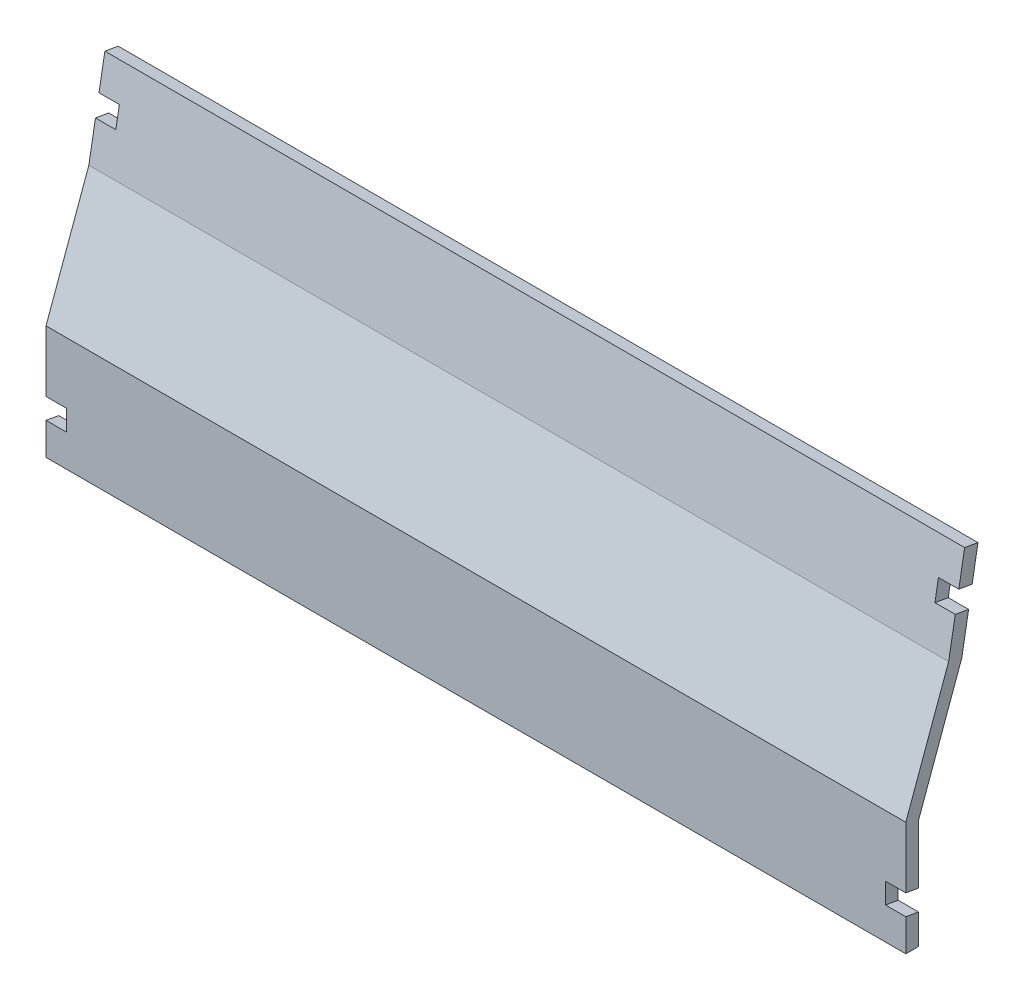
ISO-10303-21;
HEADER;
FILE_DESCRIPTION(('STEP AP214'),'2;1');
FILE_NAME('part.step','',(''),(''),'','','');
FILE_SCHEMA(('AUTOMOTIVE_DESIGN { 1 0 10303 214 1 1 1 1 }'));
ENDSEC;
DATA;
#1=APPLICATION_CONTEXT('core data for automotive mechanical design processes');
#2=APPLICATION_PROTOCOL_DEFINITION('international standard','automotive_design',2000,#1);
#3=PRODUCT_CONTEXT('',#1,'mechanical');
#4=PRODUCT('Part','Part','',(#3));
#5=PRODUCT_RELATED_PRODUCT_CATEGORY('part','',(#4));
#6=PRODUCT_DEFINITION_FORMATION('','',#4);
#7=PRODUCT_DEFINITION_CONTEXT('part definition',#1,'design');
#8=PRODUCT_DEFINITION('design','',#6,#7);
#9=PRODUCT_DEFINITION_SHAPE('','',#8);
#10=(LENGTH_UNIT() NAMED_UNIT(*) SI_UNIT(.MILLI.,.METRE.));
#11=(NAMED_UNIT(*) PLANE_ANGLE_UNIT() SI_UNIT($,.RADIAN.));
#12=(NAMED_UNIT(*) SI_UNIT($,.STERADIAN.) SOLID_ANGLE_UNIT());
#13=UNCERTAINTY_MEASURE_WITH_UNIT(LENGTH_MEASURE(1.E-05),#10,'distance_accuracy_value','');
#14=(GEOMETRIC_REPRESENTATION_CONTEXT(3) GLOBAL_UNCERTAINTY_ASSIGNED_CONTEXT((#13)) GLOBAL_UNIT_ASSIGNED_CONTEXT((#10,
#11,#12)) REPRESENTATION_CONTEXT('',''));
#15=CARTESIAN_POINT('',(0.,0.,0.));
#16=DIRECTION('',(0.,0.,1.));
#17=DIRECTION('',(1.,0.,0.));
#18=AXIS2_PLACEMENT_3D('',#15,#16,#17);
#19=CARTESIAN_POINT('',(322.072,0.,0.));
#20=DIRECTION('',(1.,0.,0.));
#21=DIRECTION('',(0.,0.,-1.));
#22=AXIS2_PLACEMENT_3D('',#19,#20,#21);
#23=PLANE('',#22);
#24=DIRECTION('',(0.,-0.173648177666933,-0.984807753012208));
#25=VECTOR('',#24,1.);
#26=CARTESIAN_POINT('',(322.072,21.8851789146028,-3.85894752027653));
#27=LINE('',#26,#25);
#28=CARTESIAN_POINT('',(322.072,-16.1026707954497,-219.298748947264));
#29=VERTEX_POINT('',#28);
#30=CARTESIAN_POINT('',(322.072,-16.9848035379977,-224.301572332566));
#31=VERTEX_POINT('',#30);
#32=EDGE_CURVE('E334',#29,#31,#27,.T.);
#33=ORIENTED_EDGE('',*,*,#32,.F.);
#34=DIRECTION('',(0.,-0.984807753012207,0.173648177666934));
#35=VECTOR('',#34,1.);
#36=CARTESIAN_POINT('',(322.072,3.8157747259693,-222.810908306462));
#37=LINE('',#36,#35);
#38=CARTESIAN_POINT('',(322.072,-30.1912873343013,-216.814545730609));
#39=VERTEX_POINT('',#38);
#40=EDGE_CURVE('E443',#29,#39,#37,.T.);
#41=ORIENTED_EDGE('',*,*,#40,.T.);
#42=DIRECTION('',(0.,-0.939692620785907,0.342020143325672));
#43=VECTOR('',#42,1.);
#44=CARTESIAN_POINT('',(322.072,-30.1912873343013,-216.814545730609));
#45=LINE('',#44,#43);
#46=CARTESIAN_POINT('',(322.072,-74.2791887182114,-200.767861935602));
#47=VERTEX_POINT('',#46);
#48=EDGE_CURVE('E448',#39,#47,#45,.T.);
#49=ORIENTED_EDGE('',*,*,#48,.T.);
#50=DIRECTION('',(0.,-1.,0.));
#51=VECTOR('',#50,1.);
#52=CARTESIAN_POINT('',(322.072,-116.964716492043,-200.767861935602));
#53=LINE('',#52,#51);
#54=CARTESIAN_POINT('',(322.072,-97.1913183543955,-200.767861935602));
#55=VERTEX_POINT('',#54);
#56=EDGE_CURVE('E451',#47,#55,#53,.T.);
#57=ORIENTED_EDGE('',*,*,#56,.T.);
#58=DIRECTION('',(0.,0.173648177666932,0.984807753012208));
#59=VECTOR('',#58,1.);
#60=CARTESIAN_POINT('',(322.072,-59.9273150510358,10.5668025249142));
#61=LINE('',#60,#59);
#62=CARTESIAN_POINT('',(322.072,-98.033039620491,-205.541500449194));
#63=VERTEX_POINT('',#62);
#64=EDGE_CURVE('E214',#63,#55,#61,.T.);
#65=ORIENTED_EDGE('',*,*,#64,.F.);
#66=DIRECTION('',(0.,1.,0.));
#67=VECTOR('',#66,1.);
#68=CARTESIAN_POINT('',(322.072,-76.0166510463058,-205.541500449194));
#69=LINE('',#68,#67);
#70=CARTESIAN_POINT('',(322.072,-76.0166510463058,-205.541500449194));
#71=VERTEX_POINT('',#70);
#72=EDGE_CURVE('E234',#63,#71,#69,.T.);
#73=ORIENTED_EDGE('',*,*,#72,.T.);
#74=DIRECTION('',(0.,0.939692620785907,-0.342020143325672));
#75=VECTOR('',#74,1.);
#76=CARTESIAN_POINT('',(322.072,-76.0166510463058,-205.541500449194));
#77=LINE('',#76,#75);
#78=CARTESIAN_POINT('',(322.072,-31.5111104086854,-221.740192501213));
#79=VERTEX_POINT('',#78);
#80=EDGE_CURVE('E233',#71,#79,#77,.T.);
#81=ORIENTED_EDGE('',*,*,#80,.T.);
#82=DIRECTION('',(0.,0.984807753012207,-0.173648177666934));
#83=VECTOR('',#82,1.);
#84=CARTESIAN_POINT('',(322.072,2.93364198342128,-227.813731691764));
#85=LINE('',#84,#83);
#86=EDGE_CURVE('E436',#79,#31,#85,.T.);
#87=ORIENTED_EDGE('',*,*,#86,.T.);
#88=EDGE_LOOP('',(#33,#41,#49,#57,#65,#73,#81,#87));
#89=FACE_BOUND('',#88,.T.);
#90=ADVANCED_FACE('F45',(#89),#23,.T.);
#91=DIRECTION('',(0.,0.173648177666933,0.984807753012208));
#92=VECTOR('',#91,1.);
#93=CARTESIAN_POINT('',(322.072,29.389413992556,-5.1821466340986));
#94=LINE('',#93,#92);
#95=CARTESIAN_POINT('',(322.072,-9.48056846004469,-225.624771446388));
#96=VERTEX_POINT('',#95);
#97=CARTESIAN_POINT('',(322.072,-8.59843571749667,-220.621948061086));
#98=VERTEX_POINT('',#97);
#99=EDGE_CURVE('E331',#96,#98,#94,.T.);
#100=ORIENTED_EDGE('',*,*,#99,.F.);
#101=CARTESIAN_POINT('',(322.072,2.93364198342128,-227.813731691764));
#102=VERTEX_POINT('',#101);
#103=EDGE_CURVE('E275',#96,#102,#85,.T.);
#104=ORIENTED_EDGE('',*,*,#103,.T.);
#105=DIRECTION('',(0.,0.173648177666933,0.984807753012207));
#106=VECTOR('',#105,1.);
#107=CARTESIAN_POINT('',(322.072,3.8157747259693,-222.810908306462));
#108=LINE('',#107,#106);
#109=CARTESIAN_POINT('',(322.072,3.8157747259693,-222.810908306462));
#110=VERTEX_POINT('',#109);
#111=EDGE_CURVE('E440',#102,#110,#108,.T.);
#112=ORIENTED_EDGE('',*,*,#111,.T.);
#113=EDGE_CURVE('E444',#110,#98,#37,.T.);
#114=ORIENTED_EDGE('',*,*,#113,.T.);
#115=EDGE_LOOP('',(#100,#104,#112,#114));
#116=FACE_BOUND('',#115,.T.);
#117=ADVANCED_FACE('F502',(#116),#23,.T.);
#118=CARTESIAN_POINT('',(0.,0.,0.));
#119=DIRECTION('',(1.,0.,0.));
#120=DIRECTION('',(0.,0.,-1.));
#121=AXIS2_PLACEMENT_3D('',#118,#119,#120);
#122=PLANE('',#121);
#123=DIRECTION('',(0.,0.984807753012207,-0.173648177666934));
#124=VECTOR('',#123,1.);
#125=CARTESIAN_POINT('',(0.,2.93364198342128,-227.813731691764));
#126=LINE('',#125,#124);
#127=CARTESIAN_POINT('',(0.,-9.4805684600447,-225.624771446388));
#128=VERTEX_POINT('',#127);
#129=CARTESIAN_POINT('',(0.,2.93364198342128,-227.813731691764));
#130=VERTEX_POINT('',#129);
#131=EDGE_CURVE('E248',#128,#130,#126,.T.);
#132=ORIENTED_EDGE('',*,*,#131,.F.);
#133=DIRECTION('',(0.,0.173648177666933,0.984807753012208));
#134=VECTOR('',#133,1.);
#135=CARTESIAN_POINT('',(0.,29.389413992556,-5.1821466340986));
#136=LINE('',#135,#134);
#137=CARTESIAN_POINT('',(0.,-8.59843571749667,-220.621948061086));
#138=VERTEX_POINT('',#137);
#139=EDGE_CURVE('E318',#128,#138,#136,.T.);
#140=ORIENTED_EDGE('',*,*,#139,.T.);
#141=DIRECTION('',(0.,-0.984807753012207,0.173648177666934));
#142=VECTOR('',#141,1.);
#143=CARTESIAN_POINT('',(0.,3.8157747259693,-222.810908306462));
#144=LINE('',#143,#142);
#145=CARTESIAN_POINT('',(0.,3.8157747259693,-222.810908306462));
#146=VERTEX_POINT('',#145);
#147=EDGE_CURVE('E252',#146,#138,#144,.T.);
#148=ORIENTED_EDGE('',*,*,#147,.F.);
#149=DIRECTION('',(0.,0.173648177666933,0.984807753012207));
#150=VECTOR('',#149,1.);
#151=CARTESIAN_POINT('',(0.,3.8157747259693,-222.810908306462));
#152=LINE('',#151,#150);
#153=EDGE_CURVE('E247',#130,#146,#152,.T.);
#154=ORIENTED_EDGE('',*,*,#153,.F.);
#155=EDGE_LOOP('',(#132,#140,#148,#154));
#156=FACE_BOUND('',#155,.T.);
#157=ADVANCED_FACE('F495',(#156),#122,.F.);
#158=CARTESIAN_POINT('',(0.,-16.1026707954497,-219.298748947264));
#159=VERTEX_POINT('',#158);
#160=CARTESIAN_POINT('',(0.,-30.1912873343013,-216.814545730609));
#161=VERTEX_POINT('',#160);
#162=EDGE_CURVE('E251',#159,#161,#144,.T.);
#163=ORIENTED_EDGE('',*,*,#162,.F.);
#164=DIRECTION('',(0.,-0.173648177666933,-0.984807753012208));
#165=VECTOR('',#164,1.);
#166=CARTESIAN_POINT('',(0.,21.8851789146028,-3.85894752027653));
#167=LINE('',#166,#165);
#168=CARTESIAN_POINT('',(0.,-16.9848035379977,-224.301572332566));
#169=VERTEX_POINT('',#168);
#170=EDGE_CURVE('E314',#159,#169,#167,.T.);
#171=ORIENTED_EDGE('',*,*,#170,.T.);
#172=CARTESIAN_POINT('',(0.,-31.5111104086854,-221.740192501213));
#173=VERTEX_POINT('',#172);
#174=EDGE_CURVE('E243',#173,#169,#126,.T.);
#175=ORIENTED_EDGE('',*,*,#174,.F.);
#176=DIRECTION('',(0.,0.939692620785907,-0.342020143325672));
#177=VECTOR('',#176,1.);
#178=CARTESIAN_POINT('',(0.,-76.0166510463058,-205.541500449194));
#179=LINE('',#178,#177);
#180=CARTESIAN_POINT('',(0.,-76.0166510463058,-205.541500449194));
#181=VERTEX_POINT('',#180);
#182=EDGE_CURVE('E272',#181,#173,#179,.T.);
#183=ORIENTED_EDGE('',*,*,#182,.F.);
#184=DIRECTION('',(0.,1.,0.));
#185=VECTOR('',#184,1.);
#186=CARTESIAN_POINT('',(0.,-76.0166510463058,-205.541500449194));
#187=LINE('',#186,#185);
#188=CARTESIAN_POINT('',(0.,-98.033039620491,-205.541500449194));
#189=VERTEX_POINT('',#188);
#190=EDGE_CURVE('E267',#189,#181,#187,.T.);
#191=ORIENTED_EDGE('',*,*,#190,.F.);
#192=DIRECTION('',(0.,0.173648177666932,0.984807753012208));
#193=VECTOR('',#192,1.);
#194=CARTESIAN_POINT('',(0.,-59.9273150510358,10.5668025249142));
#195=LINE('',#194,#193);
#196=CARTESIAN_POINT('',(0.,-97.1913183543955,-200.767861935602));
#197=VERTEX_POINT('',#196);
#198=EDGE_CURVE('E310',#189,#197,#195,.T.);
#199=ORIENTED_EDGE('',*,*,#198,.T.);
#200=DIRECTION('',(0.,-1.,0.));
#201=VECTOR('',#200,1.);
#202=CARTESIAN_POINT('',(0.,-116.964716492043,-200.767861935602));
#203=LINE('',#202,#201);
#204=CARTESIAN_POINT('',(0.,-74.2791887182114,-200.767861935602));
#205=VERTEX_POINT('',#204);
#206=EDGE_CURVE('E260',#205,#197,#203,.T.);
#207=ORIENTED_EDGE('',*,*,#206,.F.);
#208=DIRECTION('',(0.,-0.939692620785907,0.342020143325672));
#209=VECTOR('',#208,1.);
#210=CARTESIAN_POINT('',(0.,-30.1912873343013,-216.814545730609));
#211=LINE('',#210,#209);
#212=EDGE_CURVE('E256',#161,#205,#211,.T.);
#213=ORIENTED_EDGE('',*,*,#212,.F.);
#214=EDGE_LOOP('',(#163,#171,#175,#183,#191,#199,#207,#213));
#215=FACE_BOUND('',#214,.T.);
#216=ADVANCED_FACE('F480',(#215),#122,.F.);
#217=CARTESIAN_POINT('',(322.072,2.93364198342128,-227.813731691764));
#218=DIRECTION('',(0.,0.173648177666934,0.984807753012207));
#219=DIRECTION('',(0.,-0.984807753012208,0.173648177666934));
#220=AXIS2_PLACEMENT_3D('',#217,#218,#219);
#221=PLANE('',#220);
#222=DIRECTION('',(0.,0.984807753012208,-0.173648177666934));
#223=VECTOR('',#222,1.);
#224=CARTESIAN_POINT('',(314.452,2.93364198342128,-227.813731691764));
#225=LINE('',#224,#223);
#226=CARTESIAN_POINT('',(314.452,-16.9848035379977,-224.301572332566));
#227=VERTEX_POINT('',#226);
#228=CARTESIAN_POINT('',(314.452,-9.4805684600447,-225.624771446388));
#229=VERTEX_POINT('',#228);
#230=EDGE_CURVE('E377',#227,#229,#225,.T.);
#231=ORIENTED_EDGE('',*,*,#230,.F.);
#232=DIRECTION('',(1.,0.,0.));
#233=VECTOR('',#232,1.);
#234=CARTESIAN_POINT('',(322.072,-16.9848035379977,-224.301572332566));
#235=LINE('',#234,#233);
#236=EDGE_CURVE('E370',#227,#31,#235,.T.);
#237=ORIENTED_EDGE('',*,*,#236,.T.);
#238=ORIENTED_EDGE('',*,*,#86,.F.);
#239=DIRECTION('',(-1.,0.,0.));
#240=VECTOR('',#239,1.);
#241=CARTESIAN_POINT('',(322.072,-31.5111104086854,-221.740192501213));
#242=LINE('',#241,#240);
#243=EDGE_CURVE('E238',#79,#173,#242,.T.);
#244=ORIENTED_EDGE('',*,*,#243,.T.);
#245=ORIENTED_EDGE('',*,*,#174,.T.);
#246=DIRECTION('',(1.,0.,0.));
#247=VECTOR('',#246,1.);
#248=CARTESIAN_POINT('',(322.072,-16.9848035379977,-224.301572332566));
#249=LINE('',#248,#247);
#250=CARTESIAN_POINT('',(7.62000000000001,-16.9848035379977,-224.301572332566));
#251=VERTEX_POINT('',#250);
#252=EDGE_CURVE('E416',#169,#251,#249,.T.);
#253=ORIENTED_EDGE('',*,*,#252,.T.);
#254=DIRECTION('',(0.,0.984807753012208,-0.173648177666934));
#255=VECTOR('',#254,1.);
#256=CARTESIAN_POINT('',(7.62000000000002,2.93364198342128,-227.813731691764));
#257=LINE('',#256,#255);
#258=CARTESIAN_POINT('',(7.62000000000001,-9.4805684600447,-225.624771446388));
#259=VERTEX_POINT('',#258);
#260=EDGE_CURVE('E432',#251,#259,#257,.T.);
#261=ORIENTED_EDGE('',*,*,#260,.T.);
#262=DIRECTION('',(-1.,0.,0.));
#263=VECTOR('',#262,1.);
#264=CARTESIAN_POINT('',(322.072,-9.4805684600447,-225.624771446388));
#265=LINE('',#264,#263);
#266=EDGE_CURVE('E424',#259,#128,#265,.T.);
#267=ORIENTED_EDGE('',*,*,#266,.T.);
#268=ORIENTED_EDGE('',*,*,#131,.T.);
#269=DIRECTION('',(-1.,0.,0.));
#270=VECTOR('',#269,1.);
#271=CARTESIAN_POINT('',(322.072,2.93364198342128,-227.813731691764));
#272=LINE('',#271,#270);
#273=EDGE_CURVE('E302',#102,#130,#272,.T.);
#274=ORIENTED_EDGE('',*,*,#273,.F.);
#275=ORIENTED_EDGE('',*,*,#103,.F.);
#276=DIRECTION('',(-1.,0.,0.));
#277=VECTOR('',#276,1.);
#278=CARTESIAN_POINT('',(322.072,-9.4805684600447,-225.624771446388));
#279=LINE('',#278,#277);
#280=EDGE_CURVE('E69',#96,#229,#279,.T.);
#281=ORIENTED_EDGE('',*,*,#280,.T.);
#282=EDGE_LOOP('',(#231,#237,#238,#244,#245,#253,#261,#267,#268,#274,#275,#281));
#283=FACE_BOUND('',#282,.T.);
#284=ADVANCED_FACE('F47',(#283),#221,.F.);
#285=CARTESIAN_POINT('',(322.072,3.8157747259693,-222.810908306462));
#286=DIRECTION('',(0.,-0.984807753012207,0.173648177666933));
#287=DIRECTION('',(0.,-0.173648177666933,-0.984807753012208));
#288=AXIS2_PLACEMENT_3D('',#285,#286,#287);
#289=PLANE('',#288);
#290=ORIENTED_EDGE('',*,*,#153,.T.);
#291=DIRECTION('',(-1.,0.,0.));
#292=VECTOR('',#291,1.);
#293=CARTESIAN_POINT('',(322.072,3.8157747259693,-222.810908306462));
#294=LINE('',#293,#292);
#295=EDGE_CURVE('E298',#110,#146,#294,.T.);
#296=ORIENTED_EDGE('',*,*,#295,.F.);
#297=ORIENTED_EDGE('',*,*,#111,.F.);
#298=ORIENTED_EDGE('',*,*,#273,.T.);
#299=EDGE_LOOP('',(#290,#296,#297,#298));
#300=FACE_BOUND('',#299,.T.);
#301=ADVANCED_FACE('F499',(#300),#289,.F.);
#302=CARTESIAN_POINT('',(322.072,3.8157747259693,-222.810908306462));
#303=DIRECTION('',(0.,-0.173648177666934,-0.984807753012207));
#304=DIRECTION('',(0.,0.984807753012208,-0.173648177666934));
#305=AXIS2_PLACEMENT_3D('',#302,#303,#304);
#306=PLANE('',#305);
#307=ORIENTED_EDGE('',*,*,#40,.F.);
#308=DIRECTION('',(-1.,0.,0.));
#309=VECTOR('',#308,1.);
#310=CARTESIAN_POINT('',(322.072,-16.1026707954497,-219.298748947264));
#311=LINE('',#310,#309);
#312=CARTESIAN_POINT('',(314.452,-16.1026707954497,-219.298748947264));
#313=VERTEX_POINT('',#312);
#314=EDGE_CURVE('E366',#29,#313,#311,.T.);
#315=ORIENTED_EDGE('',*,*,#314,.T.);
#316=DIRECTION('',(0.,-0.984807753012208,0.173648177666934));
#317=VECTOR('',#316,1.);
#318=CARTESIAN_POINT('',(314.452,3.8157747259693,-222.810908306462));
#319=LINE('',#318,#317);
#320=CARTESIAN_POINT('',(314.452,-8.59843571749667,-220.621948061086));
#321=VERTEX_POINT('',#320);
#322=EDGE_CURVE('E11',#321,#313,#319,.T.);
#323=ORIENTED_EDGE('',*,*,#322,.F.);
#324=DIRECTION('',(1.,0.,0.));
#325=VECTOR('',#324,1.);
#326=CARTESIAN_POINT('',(322.072,-8.59843571749667,-220.621948061086));
#327=LINE('',#326,#325);
#328=EDGE_CURVE('E357',#321,#98,#327,.T.);
#329=ORIENTED_EDGE('',*,*,#328,.T.);
#330=ORIENTED_EDGE('',*,*,#113,.F.);
#331=ORIENTED_EDGE('',*,*,#295,.T.);
#332=ORIENTED_EDGE('',*,*,#147,.T.);
#333=DIRECTION('',(1.,0.,0.));
#334=VECTOR('',#333,1.);
#335=CARTESIAN_POINT('',(322.072,-8.59843571749667,-220.621948061086));
#336=LINE('',#335,#334);
#337=CARTESIAN_POINT('',(7.62000000000001,-8.59843571749667,-220.621948061086));
#338=VERTEX_POINT('',#337);
#339=EDGE_CURVE('E420',#138,#338,#336,.T.);
#340=ORIENTED_EDGE('',*,*,#339,.T.);
#341=DIRECTION('',(0.,-0.984807753012208,0.173648177666934));
#342=VECTOR('',#341,1.);
#343=CARTESIAN_POINT('',(7.62000000000002,3.8157747259693,-222.810908306462));
#344=LINE('',#343,#342);
#345=CARTESIAN_POINT('',(7.62000000000001,-16.1026707954497,-219.298748947264));
#346=VERTEX_POINT('',#345);
#347=EDGE_CURVE('E215',#338,#346,#344,.T.);
#348=ORIENTED_EDGE('',*,*,#347,.T.);
#349=DIRECTION('',(-1.,0.,0.));
#350=VECTOR('',#349,1.);
#351=CARTESIAN_POINT('',(322.072,-16.1026707954497,-219.298748947264));
#352=LINE('',#351,#350);
#353=EDGE_CURVE('E412',#346,#159,#352,.T.);
#354=ORIENTED_EDGE('',*,*,#353,.T.);
#355=ORIENTED_EDGE('',*,*,#162,.T.);
#356=DIRECTION('',(-1.,0.,0.));
#357=VECTOR('',#356,1.);
#358=CARTESIAN_POINT('',(322.072,-30.1912873343013,-216.814545730609));
#359=LINE('',#358,#357);
#360=EDGE_CURVE('E294',#39,#161,#359,.T.);
#361=ORIENTED_EDGE('',*,*,#360,.F.);
#362=EDGE_LOOP('',(#307,#315,#323,#329,#330,#331,#332,#340,#348,#354,#355,#361));
#363=FACE_BOUND('',#362,.T.);
#364=ADVANCED_FACE('F511',(#363),#306,.F.);
#365=CARTESIAN_POINT('',(322.072,-30.1912873343013,-216.814545730609));
#366=DIRECTION('',(0.,-0.342020143325672,-0.939692620785907));
#367=DIRECTION('',(0.,0.939692620785907,-0.342020143325672));
#368=AXIS2_PLACEMENT_3D('',#365,#366,#367);
#369=PLANE('',#368);
#370=ORIENTED_EDGE('',*,*,#212,.T.);
#371=DIRECTION('',(-1.,0.,0.));
#372=VECTOR('',#371,1.);
#373=CARTESIAN_POINT('',(322.072,-74.2791887182114,-200.767861935602));
#374=LINE('',#373,#372);
#375=EDGE_CURVE('E290',#47,#205,#374,.T.);
#376=ORIENTED_EDGE('',*,*,#375,.F.);
#377=ORIENTED_EDGE('',*,*,#48,.F.);
#378=ORIENTED_EDGE('',*,*,#360,.T.);
#379=EDGE_LOOP('',(#370,#376,#377,#378));
#380=FACE_BOUND('',#379,.T.);
#381=ADVANCED_FACE('F514',(#380),#369,.F.);
#382=CARTESIAN_POINT('',(322.072,-116.964716492043,-200.767861935602));
#383=DIRECTION('',(0.,0.,-1.));
#384=DIRECTION('',(-1.,0.,0.));
#385=AXIS2_PLACEMENT_3D('',#382,#383,#384);
#386=PLANE('',#385);
#387=DIRECTION('',(0.,-1.,0.));
#388=VECTOR('',#387,1.);
#389=CARTESIAN_POINT('',(314.452,-116.964716492043,-200.767861935602));
#390=LINE('',#389,#388);
#391=CARTESIAN_POINT('',(314.452,-97.1913183543955,-200.767861935602));
#392=VERTEX_POINT('',#391);
#393=CARTESIAN_POINT('',(314.452,-104.928869136965,-200.767861935602));
#394=VERTEX_POINT('',#393);
#395=EDGE_CURVE('E374',#392,#394,#390,.T.);
#396=ORIENTED_EDGE('',*,*,#395,.F.);
#397=DIRECTION('',(1.,0.,0.));
#398=VECTOR('',#397,1.);
#399=CARTESIAN_POINT('',(322.072,-97.1913183543955,-200.767861935602));
#400=LINE('',#399,#398);
#401=EDGE_CURVE('E349',#392,#55,#400,.T.);
#402=ORIENTED_EDGE('',*,*,#401,.T.);
#403=ORIENTED_EDGE('',*,*,#56,.F.);
#404=ORIENTED_EDGE('',*,*,#375,.T.);
#405=ORIENTED_EDGE('',*,*,#206,.T.);
#406=DIRECTION('',(1.,0.,0.));
#407=VECTOR('',#406,1.);
#408=CARTESIAN_POINT('',(322.072,-97.1913183543955,-200.767861935602));
#409=LINE('',#408,#407);
#410=CARTESIAN_POINT('',(7.62000000000001,-97.1913183543955,-200.767861935602));
#411=VERTEX_POINT('',#410);
#412=EDGE_CURVE('E408',#197,#411,#409,.T.);
#413=ORIENTED_EDGE('',*,*,#412,.T.);
#414=DIRECTION('',(0.,-1.,0.));
#415=VECTOR('',#414,1.);
#416=CARTESIAN_POINT('',(7.62000000000002,-116.964716492043,-200.767861935602));
#417=LINE('',#416,#415);
#418=CARTESIAN_POINT('',(7.62000000000001,-104.928869136965,-200.767861935602));
#419=VERTEX_POINT('',#418);
#420=EDGE_CURVE('E428',#411,#419,#417,.T.);
#421=ORIENTED_EDGE('',*,*,#420,.T.);
#422=DIRECTION('',(-1.,0.,0.));
#423=VECTOR('',#422,1.);
#424=CARTESIAN_POINT('',(322.072,-104.928869136965,-200.767861935602));
#425=LINE('',#424,#423);
#426=CARTESIAN_POINT('',(0.,-104.928869136965,-200.767861935602));
#427=VERTEX_POINT('',#426);
#428=EDGE_CURVE('E400',#419,#427,#425,.T.);
#429=ORIENTED_EDGE('',*,*,#428,.T.);
#430=CARTESIAN_POINT('',(0.,-116.964716492043,-200.767861935602));
#431=VERTEX_POINT('',#430);
#432=EDGE_CURVE('E259',#427,#431,#203,.T.);
#433=ORIENTED_EDGE('',*,*,#432,.T.);
#434=DIRECTION('',(-1.,0.,0.));
#435=VECTOR('',#434,1.);
#436=CARTESIAN_POINT('',(322.072,-116.964716492043,-200.767861935602));
#437=LINE('',#436,#435);
#438=CARTESIAN_POINT('',(322.072,-116.964716492043,-200.767861935602));
#439=VERTEX_POINT('',#438);
#440=EDGE_CURVE('E286',#439,#431,#437,.T.);
#441=ORIENTED_EDGE('',*,*,#440,.F.);
#442=CARTESIAN_POINT('',(322.072,-104.928869136965,-200.767861935602));
#443=VERTEX_POINT('',#442);
#444=EDGE_CURVE('E450',#443,#439,#53,.T.);
#445=ORIENTED_EDGE('',*,*,#444,.F.);
#446=DIRECTION('',(-1.,0.,0.));
#447=VECTOR('',#446,1.);
#448=CARTESIAN_POINT('',(322.072,-104.928869136965,-200.767861935602));
#449=LINE('',#448,#447);
#450=EDGE_CURVE('E61',#443,#394,#449,.T.);
#451=ORIENTED_EDGE('',*,*,#450,.T.);
#452=EDGE_LOOP('',(#396,#402,#403,#404,#405,#413,#421,#429,#433,#441,#445,#451));
#453=FACE_BOUND('',#452,.T.);
#454=ADVANCED_FACE('F460',(#453),#386,.F.);
#455=CARTESIAN_POINT('',(322.072,-116.964716492043,-205.541500449194));
#456=DIRECTION('',(0.,1.,0.));
#457=DIRECTION('',(0.,0.,1.));
#458=AXIS2_PLACEMENT_3D('',#455,#456,#457);
#459=PLANE('',#458);
#460=DIRECTION('',(0.,0.,-1.));
#461=VECTOR('',#460,1.);
#462=CARTESIAN_POINT('',(0.,-116.964716492043,-205.541500449194));
#463=LINE('',#462,#461);
#464=CARTESIAN_POINT('',(0.,-116.964716492043,-205.541500449194));
#465=VERTEX_POINT('',#464);
#466=EDGE_CURVE('E264',#431,#465,#463,.T.);
#467=ORIENTED_EDGE('',*,*,#466,.T.);
#468=DIRECTION('',(-1.,0.,0.));
#469=VECTOR('',#468,1.);
#470=CARTESIAN_POINT('',(322.072,-116.964716492043,-205.541500449194));
#471=LINE('',#470,#469);
#472=CARTESIAN_POINT('',(322.072,-116.964716492043,-205.541500449194));
#473=VERTEX_POINT('',#472);
#474=EDGE_CURVE('E283',#473,#465,#471,.T.);
#475=ORIENTED_EDGE('',*,*,#474,.F.);
#476=DIRECTION('',(0.,0.,-1.));
#477=VECTOR('',#476,1.);
#478=CARTESIAN_POINT('',(322.072,-116.964716492043,-205.541500449194));
#479=LINE('',#478,#477);
#480=EDGE_CURVE('E230',#439,#473,#479,.T.);
#481=ORIENTED_EDGE('',*,*,#480,.F.);
#482=ORIENTED_EDGE('',*,*,#440,.T.);
#483=EDGE_LOOP('',(#467,#475,#481,#482));
#484=FACE_BOUND('',#483,.T.);
#485=ADVANCED_FACE('F464',(#484),#459,.F.);
#486=CARTESIAN_POINT('',(322.072,-76.0166510463058,-205.541500449194));
#487=DIRECTION('',(0.,0.,1.));
#488=DIRECTION('',(0.,-1.,0.));
#489=AXIS2_PLACEMENT_3D('',#486,#487,#488);
#490=PLANE('',#489);
#491=ORIENTED_EDGE('',*,*,#72,.F.);
#492=DIRECTION('',(-1.,0.,0.));
#493=VECTOR('',#492,1.);
#494=CARTESIAN_POINT('',(322.072,-98.033039620491,-205.541500449194));
#495=LINE('',#494,#493);
#496=CARTESIAN_POINT('',(314.452,-98.0330396204909,-205.541500449194));
#497=VERTEX_POINT('',#496);
#498=EDGE_CURVE('E346',#63,#497,#495,.T.);
#499=ORIENTED_EDGE('',*,*,#498,.T.);
#500=DIRECTION('',(0.,1.,0.));
#501=VECTOR('',#500,1.);
#502=CARTESIAN_POINT('',(314.452,-76.0166510463058,-205.541500449194));
#503=LINE('',#502,#501);
#504=CARTESIAN_POINT('',(314.452,-105.77059040306,-205.541500449194));
#505=VERTEX_POINT('',#504);
#506=EDGE_CURVE('E54',#505,#497,#503,.T.);
#507=ORIENTED_EDGE('',*,*,#506,.F.);
#508=DIRECTION('',(1.,0.,0.));
#509=VECTOR('',#508,1.);
#510=CARTESIAN_POINT('',(322.072,-105.77059040306,-205.541500449194));
#511=LINE('',#510,#509);
#512=CARTESIAN_POINT('',(322.072,-105.77059040306,-205.541500449194));
#513=VERTEX_POINT('',#512);
#514=EDGE_CURVE('E208',#505,#513,#511,.T.);
#515=ORIENTED_EDGE('',*,*,#514,.T.);
#516=EDGE_CURVE('E223',#473,#513,#69,.T.);
#517=ORIENTED_EDGE('',*,*,#516,.F.);
#518=ORIENTED_EDGE('',*,*,#474,.T.);
#519=CARTESIAN_POINT('',(0.,-105.77059040306,-205.541500449194));
#520=VERTEX_POINT('',#519);
#521=EDGE_CURVE('E268',#465,#520,#187,.T.);
#522=ORIENTED_EDGE('',*,*,#521,.T.);
#523=DIRECTION('',(1.,0.,0.));
#524=VECTOR('',#523,1.);
#525=CARTESIAN_POINT('',(322.072,-105.77059040306,-205.541500449194));
#526=LINE('',#525,#524);
#527=CARTESIAN_POINT('',(7.62000000000001,-105.77059040306,-205.541500449194));
#528=VERTEX_POINT('',#527);
#529=EDGE_CURVE('E390',#520,#528,#526,.T.);
#530=ORIENTED_EDGE('',*,*,#529,.T.);
#531=DIRECTION('',(0.,1.,0.));
#532=VECTOR('',#531,1.);
#533=CARTESIAN_POINT('',(7.62000000000002,-76.0166510463058,-205.541500449194));
#534=LINE('',#533,#532);
#535=CARTESIAN_POINT('',(7.62000000000001,-98.0330396204909,-205.541500449194));
#536=VERTEX_POINT('',#535);
#537=EDGE_CURVE('E322',#528,#536,#534,.T.);
#538=ORIENTED_EDGE('',*,*,#537,.T.);
#539=DIRECTION('',(-1.,0.,0.));
#540=VECTOR('',#539,1.);
#541=CARTESIAN_POINT('',(322.072,-98.033039620491,-205.541500449194));
#542=LINE('',#541,#540);
#543=EDGE_CURVE('E404',#536,#189,#542,.T.);
#544=ORIENTED_EDGE('',*,*,#543,.T.);
#545=ORIENTED_EDGE('',*,*,#190,.T.);
#546=DIRECTION('',(-1.,0.,0.));
#547=VECTOR('',#546,1.);
#548=CARTESIAN_POINT('',(322.072,-76.0166510463058,-205.541500449194));
#549=LINE('',#548,#547);
#550=EDGE_CURVE('E279',#71,#181,#549,.T.);
#551=ORIENTED_EDGE('',*,*,#550,.F.);
#552=EDGE_LOOP('',(#491,#499,#507,#515,#517,#518,#522,#530,#538,#544,#545,#551));
#553=FACE_BOUND('',#552,.T.);
#554=ADVANCED_FACE('F221',(#553),#490,.F.);
#555=CARTESIAN_POINT('',(322.072,-76.0166510463058,-205.541500449194));
#556=DIRECTION('',(0.,0.342020143325672,0.939692620785907));
#557=DIRECTION('',(0.,-0.939692620785907,0.342020143325672));
#558=AXIS2_PLACEMENT_3D('',#555,#556,#557);
#559=PLANE('',#558);
#560=ORIENTED_EDGE('',*,*,#182,.T.);
#561=ORIENTED_EDGE('',*,*,#243,.F.);
#562=ORIENTED_EDGE('',*,*,#80,.F.);
#563=ORIENTED_EDGE('',*,*,#550,.T.);
#564=EDGE_LOOP('',(#560,#561,#562,#563));
#565=FACE_BOUND('',#564,.T.);
#566=ADVANCED_FACE('F533',(#565),#559,.F.);
#567=DIRECTION('',(0.,-0.173648177666933,-0.984807753012208));
#568=VECTOR('',#567,1.);
#569=CARTESIAN_POINT('',(322.072,-67.4315501289887,11.8900016387362));
#570=LINE('',#569,#568);
#571=EDGE_CURVE('E205',#443,#513,#570,.T.);
#572=ORIENTED_EDGE('',*,*,#571,.F.);
#573=ORIENTED_EDGE('',*,*,#444,.T.);
#574=ORIENTED_EDGE('',*,*,#480,.T.);
#575=ORIENTED_EDGE('',*,*,#516,.T.);
#576=EDGE_LOOP('',(#572,#573,#574,#575));
#577=FACE_BOUND('',#576,.T.);
#578=ADVANCED_FACE('F228',(#577),#23,.T.);
#579=ORIENTED_EDGE('',*,*,#432,.F.);
#580=DIRECTION('',(0.,-0.173648177666933,-0.984807753012208));
#581=VECTOR('',#580,1.);
#582=CARTESIAN_POINT('',(0.,-67.4315501289887,11.8900016387362));
#583=LINE('',#582,#581);
#584=EDGE_CURVE('E306',#427,#520,#583,.T.);
#585=ORIENTED_EDGE('',*,*,#584,.T.);
#586=ORIENTED_EDGE('',*,*,#521,.F.);
#587=ORIENTED_EDGE('',*,*,#466,.F.);
#588=EDGE_LOOP('',(#579,#585,#586,#587));
#589=FACE_BOUND('',#588,.T.);
#590=ADVANCED_FACE('F467',(#589),#122,.F.);
#591=CARTESIAN_POINT('',(7.62,0.,0.));
#592=DIRECTION('',(1.,0.,0.));
#593=DIRECTION('',(0.,0.,-1.));
#594=AXIS2_PLACEMENT_3D('',#591,#592,#593);
#595=PLANE('',#594);
#596=DIRECTION('',(0.,-0.173648177666932,-0.984807753012208));
#597=VECTOR('',#596,1.);
#598=CARTESIAN_POINT('',(7.62,-98.6441419305072,-209.007233869916));
#599=LINE('',#598,#597);
#600=EDGE_CURVE('E380',#411,#536,#599,.T.);
#601=ORIENTED_EDGE('',*,*,#600,.T.);
#602=ORIENTED_EDGE('',*,*,#537,.F.);
#603=DIRECTION('',(0.,0.173648177666933,0.984807753012208));
#604=VECTOR('',#603,1.);
#605=CARTESIAN_POINT('',(7.62,-103.735294485433,-193.99876371401));
#606=LINE('',#605,#604);
#607=EDGE_CURVE('E386',#528,#419,#606,.T.);
#608=ORIENTED_EDGE('',*,*,#607,.T.);
#609=ORIENTED_EDGE('',*,*,#420,.F.);
#610=EDGE_LOOP('',(#601,#602,#608,#609));
#611=FACE_BOUND('',#610,.T.);
#612=ADVANCED_FACE('F473',(#611),#595,.F.);
#613=CARTESIAN_POINT('',(7.62,-98.6441419305072,-209.007233869916));
#614=DIRECTION('',(0.,0.984807753012208,-0.173648177666932));
#615=DIRECTION('',(0.,0.173648177666932,0.984807753012208));
#616=AXIS2_PLACEMENT_3D('',#613,#614,#615);
#617=PLANE('',#616);
#618=ORIENTED_EDGE('',*,*,#198,.F.);
#619=ORIENTED_EDGE('',*,*,#543,.F.);
#620=ORIENTED_EDGE('',*,*,#600,.F.);
#621=ORIENTED_EDGE('',*,*,#412,.F.);
#622=EDGE_LOOP('',(#618,#619,#620,#621));
#623=FACE_BOUND('',#622,.T.);
#624=ADVANCED_FACE('F475',(#623),#617,.F.);
#625=CARTESIAN_POINT('',(7.62,-103.735294485433,-193.99876371401));
#626=DIRECTION('',(0.,-0.984807753012208,0.173648177666933));
#627=DIRECTION('',(0.,-0.173648177666933,-0.984807753012208));
#628=AXIS2_PLACEMENT_3D('',#625,#626,#627);
#629=PLANE('',#628);
#630=ORIENTED_EDGE('',*,*,#607,.F.);
#631=ORIENTED_EDGE('',*,*,#529,.F.);
#632=ORIENTED_EDGE('',*,*,#584,.F.);
#633=ORIENTED_EDGE('',*,*,#428,.F.);
#634=EDGE_LOOP('',(#630,#631,#632,#633));
#635=FACE_BOUND('',#634,.T.);
#636=ADVANCED_FACE('F470',(#635),#629,.F.);
#637=CARTESIAN_POINT('',(7.62,0.,0.));
#638=DIRECTION('',(1.,0.,0.));
#639=DIRECTION('',(0.,0.,-1.));
#640=AXIS2_PLACEMENT_3D('',#637,#638,#639);
#641=PLANE('',#640);
#642=DIRECTION('',(0.,0.173648177666933,0.984807753012208));
#643=VECTOR('',#642,1.);
#644=CARTESIAN_POINT('',(7.62,-14.8409852033886,-212.143374386934));
#645=LINE('',#644,#643);
#646=EDGE_CURVE('E381',#251,#346,#645,.T.);
#647=ORIENTED_EDGE('',*,*,#646,.T.);
#648=ORIENTED_EDGE('',*,*,#347,.F.);
#649=DIRECTION('',(0.,-0.173648177666933,-0.984807753012207));
#650=VECTOR('',#649,1.);
#651=CARTESIAN_POINT('',(7.62,-9.98314835307957,-228.475043656662));
#652=LINE('',#651,#650);
#653=EDGE_CURVE('E385',#338,#259,#652,.T.);
#654=ORIENTED_EDGE('',*,*,#653,.T.);
#655=ORIENTED_EDGE('',*,*,#260,.F.);
#656=EDGE_LOOP('',(#647,#648,#654,#655));
#657=FACE_BOUND('',#656,.T.);
#658=ADVANCED_FACE('F539',(#657),#641,.F.);
#659=CARTESIAN_POINT('',(7.62,-9.98314835307957,-228.475043656662));
#660=DIRECTION('',(0.,0.984807753012207,-0.173648177666933));
#661=DIRECTION('',(0.,0.173648177666933,0.984807753012208));
#662=AXIS2_PLACEMENT_3D('',#659,#660,#661);
#663=PLANE('',#662);
#664=ORIENTED_EDGE('',*,*,#653,.F.);
#665=ORIENTED_EDGE('',*,*,#339,.F.);
#666=ORIENTED_EDGE('',*,*,#139,.F.);
#667=ORIENTED_EDGE('',*,*,#266,.F.);
#668=EDGE_LOOP('',(#664,#665,#666,#667));
#669=FACE_BOUND('',#668,.T.);
#670=ADVANCED_FACE('F541',(#669),#663,.F.);
#671=CARTESIAN_POINT('',(7.62,-14.8409852033886,-212.143374386934));
#672=DIRECTION('',(0.,-0.984807753012208,0.173648177666933));
#673=DIRECTION('',(0.,-0.173648177666933,-0.984807753012208));
#674=AXIS2_PLACEMENT_3D('',#671,#672,#673);
#675=PLANE('',#674);
#676=ORIENTED_EDGE('',*,*,#170,.F.);
#677=ORIENTED_EDGE('',*,*,#353,.F.);
#678=ORIENTED_EDGE('',*,*,#646,.F.);
#679=ORIENTED_EDGE('',*,*,#252,.F.);
#680=EDGE_LOOP('',(#676,#677,#678,#679));
#681=FACE_BOUND('',#680,.T.);
#682=ADVANCED_FACE('F535',(#681),#675,.F.);
#683=CARTESIAN_POINT('',(314.452,0.,0.));
#684=DIRECTION('',(1.,0.,0.));
#685=DIRECTION('',(0.,0.,-1.));
#686=AXIS2_PLACEMENT_3D('',#683,#684,#685);
#687=PLANE('',#686);
#688=ORIENTED_EDGE('',*,*,#395,.T.);
#689=DIRECTION('',(0.,-0.173648177666933,-0.984807753012208));
#690=VECTOR('',#689,1.);
#691=CARTESIAN_POINT('',(314.452,-103.735294485433,-193.99876371401));
#692=LINE('',#691,#690);
#693=EDGE_CURVE('E343',#394,#505,#692,.T.);
#694=ORIENTED_EDGE('',*,*,#693,.T.);
#695=ORIENTED_EDGE('',*,*,#506,.T.);
#696=DIRECTION('',(0.,0.173648177666932,0.984807753012208));
#697=VECTOR('',#696,1.);
#698=CARTESIAN_POINT('',(314.452,-98.6441419305072,-209.007233869916));
#699=LINE('',#698,#697);
#700=EDGE_CURVE('E341',#497,#392,#699,.T.);
#701=ORIENTED_EDGE('',*,*,#700,.T.);
#702=EDGE_LOOP('',(#688,#694,#695,#701));
#703=FACE_BOUND('',#702,.T.);
#704=ADVANCED_FACE('F340',(#703),#687,.T.);
#705=CARTESIAN_POINT('',(314.452,-98.6441419305072,-209.007233869916));
#706=DIRECTION('',(0.,0.984807753012208,-0.173648177666932));
#707=DIRECTION('',(0.,0.173648177666932,0.984807753012208));
#708=AXIS2_PLACEMENT_3D('',#705,#706,#707);
#709=PLANE('',#708);
#710=ORIENTED_EDGE('',*,*,#700,.F.);
#711=ORIENTED_EDGE('',*,*,#498,.F.);
#712=ORIENTED_EDGE('',*,*,#64,.T.);
#713=ORIENTED_EDGE('',*,*,#401,.F.);
#714=EDGE_LOOP('',(#710,#711,#712,#713));
#715=FACE_BOUND('',#714,.T.);
#716=ADVANCED_FACE('F345',(#715),#709,.F.);
#717=CARTESIAN_POINT('',(314.452,-103.735294485433,-193.99876371401));
#718=DIRECTION('',(0.,-0.984807753012208,0.173648177666933));
#719=DIRECTION('',(0.,-0.173648177666933,-0.984807753012208));
#720=AXIS2_PLACEMENT_3D('',#717,#718,#719);
#721=PLANE('',#720);
#722=ORIENTED_EDGE('',*,*,#571,.T.);
#723=ORIENTED_EDGE('',*,*,#514,.F.);
#724=ORIENTED_EDGE('',*,*,#693,.F.);
#725=ORIENTED_EDGE('',*,*,#450,.F.);
#726=EDGE_LOOP('',(#722,#723,#724,#725));
#727=FACE_BOUND('',#726,.T.);
#728=ADVANCED_FACE('F207',(#727),#721,.F.);
#729=CARTESIAN_POINT('',(314.452,0.,0.));
#730=DIRECTION('',(1.,0.,0.));
#731=DIRECTION('',(0.,0.,-1.));
#732=AXIS2_PLACEMENT_3D('',#729,#730,#731);
#733=PLANE('',#732);
#734=ORIENTED_EDGE('',*,*,#230,.T.);
#735=DIRECTION('',(0.,0.173648177666933,0.984807753012207));
#736=VECTOR('',#735,1.);
#737=CARTESIAN_POINT('',(314.452,-9.98314835307957,-228.475043656662));
#738=LINE('',#737,#736);
#739=EDGE_CURVE('E516',#229,#321,#738,.T.);
#740=ORIENTED_EDGE('',*,*,#739,.T.);
#741=ORIENTED_EDGE('',*,*,#322,.T.);
#742=DIRECTION('',(0.,-0.173648177666933,-0.984807753012208));
#743=VECTOR('',#742,1.);
#744=CARTESIAN_POINT('',(314.452,-14.8409852033886,-212.143374386934));
#745=LINE('',#744,#743);
#746=EDGE_CURVE('E226',#313,#227,#745,.T.);
#747=ORIENTED_EDGE('',*,*,#746,.T.);
#748=EDGE_LOOP('',(#734,#740,#741,#747));
#749=FACE_BOUND('',#748,.T.);
#750=ADVANCED_FACE('F526',(#749),#733,.T.);
#751=CARTESIAN_POINT('',(314.452,-14.8409852033886,-212.143374386934));
#752=DIRECTION('',(0.,-0.984807753012208,0.173648177666933));
#753=DIRECTION('',(0.,-0.173648177666933,-0.984807753012208));
#754=AXIS2_PLACEMENT_3D('',#751,#752,#753);
#755=PLANE('',#754);
#756=ORIENTED_EDGE('',*,*,#746,.F.);
#757=ORIENTED_EDGE('',*,*,#314,.F.);
#758=ORIENTED_EDGE('',*,*,#32,.T.);
#759=ORIENTED_EDGE('',*,*,#236,.F.);
#760=EDGE_LOOP('',(#756,#757,#758,#759));
#761=FACE_BOUND('',#760,.T.);
#762=ADVANCED_FACE('F544',(#761),#755,.F.);
#763=CARTESIAN_POINT('',(314.452,-9.98314835307957,-228.475043656662));
#764=DIRECTION('',(0.,0.984807753012207,-0.173648177666933));
#765=DIRECTION('',(0.,0.173648177666933,0.984807753012208));
#766=AXIS2_PLACEMENT_3D('',#763,#764,#765);
#767=PLANE('',#766);
#768=ORIENTED_EDGE('',*,*,#99,.T.);
#769=ORIENTED_EDGE('',*,*,#328,.F.);
#770=ORIENTED_EDGE('',*,*,#739,.F.);
#771=ORIENTED_EDGE('',*,*,#280,.F.);
#772=EDGE_LOOP('',(#768,#769,#770,#771));
#773=FACE_BOUND('',#772,.T.);
#774=ADVANCED_FACE('F542',(#773),#767,.F.);
#775=CLOSED_SHELL('',(#90,#117,#157,#216,#284,#301,#364,#381,#454,#485,#554,#566,#578,#590,#612,
#624,#636,#658,#670,#682,#704,#716,#728,#750,#762,#774));
#776=MANIFOLD_SOLID_BREP('B2',#775);
#777=ADVANCED_BREP_SHAPE_REPRESENTATION('',(#18,#776),#14);
#778=SHAPE_DEFINITION_REPRESENTATION(#9,#777);
ENDSEC;
END-ISO-10303-21;
